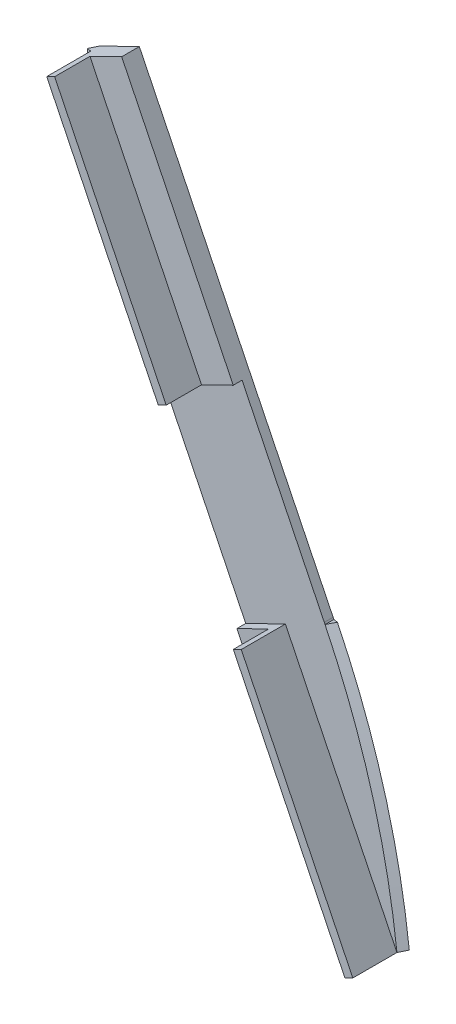
ISO-10303-21;
HEADER;
FILE_DESCRIPTION(('STEP AP214'),'2;1');
FILE_NAME('part.step','',(''),(''),'','','');
FILE_SCHEMA(('AUTOMOTIVE_DESIGN { 1 0 10303 214 1 1 1 1 }'));
ENDSEC;
DATA;
#1=APPLICATION_CONTEXT('core data for automotive mechanical design processes');
#2=APPLICATION_PROTOCOL_DEFINITION('international standard','automotive_design',2000,#1);
#3=PRODUCT_CONTEXT('',#1,'mechanical');
#4=PRODUCT('Part','Part','',(#3));
#5=PRODUCT_RELATED_PRODUCT_CATEGORY('part','',(#4));
#6=PRODUCT_DEFINITION_FORMATION('','',#4);
#7=PRODUCT_DEFINITION_CONTEXT('part definition',#1,'design');
#8=PRODUCT_DEFINITION('design','',#6,#7);
#9=PRODUCT_DEFINITION_SHAPE('','',#8);
#10=(LENGTH_UNIT() NAMED_UNIT(*) SI_UNIT(.MILLI.,.METRE.));
#11=(NAMED_UNIT(*) PLANE_ANGLE_UNIT() SI_UNIT($,.RADIAN.));
#12=(NAMED_UNIT(*) SI_UNIT($,.STERADIAN.) SOLID_ANGLE_UNIT());
#13=UNCERTAINTY_MEASURE_WITH_UNIT(LENGTH_MEASURE(1.E-05),#10,'distance_accuracy_value','');
#14=(GEOMETRIC_REPRESENTATION_CONTEXT(3) GLOBAL_UNCERTAINTY_ASSIGNED_CONTEXT((#13)) GLOBAL_UNIT_ASSIGNED_CONTEXT((#10,
#11,#12)) REPRESENTATION_CONTEXT('',''));
#15=CARTESIAN_POINT('',(0.,0.,0.));
#16=DIRECTION('',(0.,0.,1.));
#17=DIRECTION('',(1.,0.,0.));
#18=AXIS2_PLACEMENT_3D('',#15,#16,#17);
#19=CARTESIAN_POINT('',(541.281171858888,168.838199082787,737.));
#20=DIRECTION('',(0.,0.,-1.));
#21=DIRECTION('',(0.438371146789082,-0.898794046299165,0.));
#22=AXIS2_PLACEMENT_3D('',#19,#20,#21);
#23=PLANE('',#22);
#24=DIRECTION('',(0.898794046299165,0.438371146789082,0.));
#25=VECTOR('',#24,1.);
#26=CARTESIAN_POINT('',(99.8110952294884,-45.1752745496518,737.));
#27=LINE('',#26,#25);
#28=CARTESIAN_POINT('',(99.8110952294884,-45.1752745496518,737.));
#29=VERTEX_POINT('',#28);
#30=CARTESIAN_POINT('',(126.774916618463,-32.0241401459793,737.));
#31=VERTEX_POINT('',#30);
#32=EDGE_CURVE('E604',#29,#31,#27,.T.);
#33=ORIENTED_EDGE('',*,*,#32,.F.);
#34=DIRECTION('',(0.438371146789082,-0.898794046299165,0.));
#35=VECTOR('',#34,1.);
#36=CARTESIAN_POINT('',(23.9728868349773,110.316095460104,737.));
#37=LINE('',#36,#35);
#38=CARTESIAN_POINT('',(23.9728868349773,110.316095460104,737.));
#39=VERTEX_POINT('',#38);
#40=EDGE_CURVE('E633',#39,#29,#37,.T.);
#41=ORIENTED_EDGE('',*,*,#40,.F.);
#42=CARTESIAN_POINT('',(23.9728868349773,110.316095460104,737.));
#43=CARTESIAN_POINT('',(30.5996850451975,51.7382692180576,737.));
#44=CARTESIAN_POINT('',(47.1278272447323,-5.2875613642423,737.));
#45=CARTESIAN_POINT('',(72.8484642933743,-58.325831649288,737.));
#46=B_SPLINE_CURVE_WITH_KNOTS('',3,(#42,#43,#44,#45),.UNSPECIFIED.,.F.,.F.,(4,4),(0.,1.),.UNSPECIFIED.);
#47=CARTESIAN_POINT('',(72.8484642933743,-58.325831649288,737.));
#48=VERTEX_POINT('',#47);
#49=EDGE_CURVE('E522',#39,#48,#46,.T.);
#50=ORIENTED_EDGE('',*,*,#49,.T.);
#51=CARTESIAN_POINT('',(541.281171858888,168.838199082787,737.));
#52=DIRECTION('',(0.,0.,-1.));
#53=DIRECTION('',(-0.898794046299165,-0.438371146789081,0.));
#54=AXIS2_PLACEMENT_3D('',#51,#52,#53);
#55=CIRCLE('',#54,520.608008358308);
#56=CARTESIAN_POINT('',(73.3617934907751,-59.3813305688237,737.));
#57=VERTEX_POINT('',#56);
#58=EDGE_CURVE('E698',#57,#48,#55,.T.);
#59=ORIENTED_EDGE('',*,*,#58,.F.);
#60=DIRECTION('',(-0.438371146789082,0.898794046299165,0.));
#61=VECTOR('',#60,1.);
#62=CARTESIAN_POINT('',(101.056549710641,-116.163995638017,737.));
#63=LINE('',#62,#61);
#64=CARTESIAN_POINT('',(129.265825580769,-174.00158232271,737.));
#65=VERTEX_POINT('',#64);
#66=EDGE_CURVE('E338',#65,#57,#63,.T.);
#67=ORIENTED_EDGE('',*,*,#66,.F.);
#68=DIRECTION('',(-0.898794046299165,-0.438371146789082,0.));
#69=VECTOR('',#68,1.);
#70=CARTESIAN_POINT('',(156.229646969744,-160.850447919037,737.));
#71=LINE('',#70,#69);
#72=CARTESIAN_POINT('',(156.229646969744,-160.850447919037,737.));
#73=VERTEX_POINT('',#72);
#74=EDGE_CURVE('E655',#73,#65,#71,.T.);
#75=ORIENTED_EDGE('',*,*,#74,.F.);
#76=DIRECTION('',(-0.438371146789082,0.898794046299165,0.));
#77=VECTOR('',#76,1.);
#78=CARTESIAN_POINT('',(232.067855364255,-316.341817928793,737.));
#79=LINE('',#78,#77);
#80=CARTESIAN_POINT('',(232.067855364255,-316.341817928793,737.));
#81=VERTEX_POINT('',#80);
#82=EDGE_CURVE('E378',#81,#73,#79,.T.);
#83=ORIENTED_EDGE('',*,*,#82,.F.);
#84=CARTESIAN_POINT('',(232.067855364255,-316.341817928793,737.));
#85=CARTESIAN_POINT('',(225.441057154035,-257.763991686746,737.));
#86=CARTESIAN_POINT('',(208.9129149545,-200.738161104447,737.));
#87=CARTESIAN_POINT('',(183.192277905858,-147.699890819401,737.));
#88=B_SPLINE_CURVE_WITH_KNOTS('',3,(#84,#85,#86,#87),.UNSPECIFIED.,.F.,.F.,(4,4),(0.,1.),.UNSPECIFIED.);
#89=CARTESIAN_POINT('',(183.192277905858,-147.699890819401,737.));
#90=VERTEX_POINT('',#89);
#91=EDGE_CURVE('E274',#81,#90,#88,.T.);
#92=ORIENTED_EDGE('',*,*,#91,.T.);
#93=CARTESIAN_POINT('',(-285.240429659655,-374.863921551476,737.));
#94=DIRECTION('',(0.,0.,-1.));
#95=DIRECTION('',(0.438371146789082,-0.898794046299165,0.));
#96=AXIS2_PLACEMENT_3D('',#93,#94,#95);
#97=CIRCLE('',#96,520.608008358308);
#98=CARTESIAN_POINT('',(182.678948708457,-146.644391899865,737.));
#99=VERTEX_POINT('',#98);
#100=EDGE_CURVE('E330',#99,#90,#97,.T.);
#101=ORIENTED_EDGE('',*,*,#100,.F.);
#102=DIRECTION('',(0.438371146789082,-0.898794046299165,0.));
#103=VECTOR('',#102,1.);
#104=CARTESIAN_POINT('',(154.984192488591,-89.861726830672,737.));
#105=LINE('',#104,#103);
#106=EDGE_CURVE('E339',#31,#99,#105,.T.);
#107=ORIENTED_EDGE('',*,*,#106,.F.);
#108=EDGE_LOOP('',(#33,#41,#50,#59,#67,#75,#83,#92,#101,#107));
#109=FACE_BOUND('',#108,.T.);
#110=ADVANCED_FACE('F134',(#109),#23,.F.);
#111=CARTESIAN_POINT('',(541.281171858888,168.838199082787,737.));
#112=DIRECTION('',(0.,0.,-1.));
#113=DIRECTION('',(0.438371146789082,-0.898794046299165,0.));
#114=AXIS2_PLACEMENT_3D('',#111,#112,#113);
#115=CYLINDRICAL_SURFACE('',#114,520.608008358308);
#116=DIRECTION('',(0.,0.,1.));
#117=VECTOR('',#116,1.);
#118=CARTESIAN_POINT('',(72.8472738405134,-58.3264089533242,731.));
#119=LINE('',#118,#117);
#120=CARTESIAN_POINT('',(72.848461990243,-58.3258294568053,731.));
#121=VERTEX_POINT('',#120);
#122=EDGE_CURVE('E521',#121,#48,#119,.T.);
#123=ORIENTED_EDGE('',*,*,#122,.F.);
#124=CARTESIAN_POINT('',(541.281171858888,168.838199082787,731.));
#125=DIRECTION('',(0.,0.,-1.));
#126=DIRECTION('',(0.438371146789082,-0.898794046299165,0.));
#127=AXIS2_PLACEMENT_3D('',#124,#125,#126);
#128=CIRCLE('',#127,520.608008358308);
#129=CARTESIAN_POINT('',(73.3617934907752,-59.3813305688239,731.));
#130=VERTEX_POINT('',#129);
#131=EDGE_CURVE('E789',#130,#121,#128,.T.);
#132=ORIENTED_EDGE('',*,*,#131,.F.);
#133=DIRECTION('',(0.,0.,1.));
#134=VECTOR('',#133,1.);
#135=CARTESIAN_POINT('',(73.3617934907753,-59.3813305688241,731.));
#136=LINE('',#135,#134);
#137=EDGE_CURVE('E147',#130,#57,#136,.T.);
#138=ORIENTED_EDGE('',*,*,#137,.T.);
#139=ORIENTED_EDGE('',*,*,#58,.T.);
#140=EDGE_LOOP('',(#123,#132,#138,#139));
#141=FACE_BOUND('',#140,.T.);
#142=ADVANCED_FACE('F321',(#141),#115,.T.);
#143=CARTESIAN_POINT('',(205.10403397528,-329.492952332465,737.));
#144=DIRECTION('',(0.438371146789082,-0.898794046299165,0.));
#145=DIRECTION('',(0.,0.,1.));
#146=AXIS2_PLACEMENT_3D('',#143,#144,#145);
#147=PLANE('',#146);
#148=DIRECTION('',(-0.898794046299165,-0.438371146789082,0.));
#149=VECTOR('',#148,1.);
#150=CARTESIAN_POINT('',(205.10403397528,-329.492952332465,731.));
#151=LINE('',#150,#149);
#152=CARTESIAN_POINT('',(232.067855364255,-316.341817928793,731.));
#153=VERTEX_POINT('',#152);
#154=CARTESIAN_POINT('',(205.10403397528,-329.492952332465,731.));
#155=VERTEX_POINT('',#154);
#156=EDGE_CURVE('E301',#153,#155,#151,.T.);
#157=ORIENTED_EDGE('',*,*,#156,.F.);
#158=DIRECTION('',(0.803905834118811,0.39209107343797,0.447213595499958));
#159=VECTOR('',#158,1.);
#160=CARTESIAN_POINT('',(232.067855364255,-316.341817928793,731.));
#161=LINE('',#160,#159);
#162=CARTESIAN_POINT('',(237.46061964205,-313.711591048058,734.));
#163=VERTEX_POINT('',#162);
#164=EDGE_CURVE('E281',#153,#163,#161,.T.);
#165=ORIENTED_EDGE('',*,*,#164,.T.);
#166=DIRECTION('',(-0.803905834118811,-0.39209107343797,0.447213595499958));
#167=VECTOR('',#166,1.);
#168=CARTESIAN_POINT('',(232.067855364255,-316.341817928793,737.));
#169=LINE('',#168,#167);
#170=EDGE_CURVE('E267',#163,#81,#169,.T.);
#171=ORIENTED_EDGE('',*,*,#170,.T.);
#172=DIRECTION('',(0.,0.,-1.));
#173=VECTOR('',#172,1.);
#174=CARTESIAN_POINT('',(232.067855364255,-316.341817928793,767.));
#175=LINE('',#174,#173);
#176=CARTESIAN_POINT('',(232.067855364255,-316.341817928793,767.));
#177=VERTEX_POINT('',#176);
#178=EDGE_CURVE('E678',#177,#81,#175,.T.);
#179=ORIENTED_EDGE('',*,*,#178,.F.);
#180=DIRECTION('',(0.898794046299165,0.438371146789082,0.));
#181=VECTOR('',#180,1.);
#182=CARTESIAN_POINT('',(229.371473225358,-317.65693136916,767.));
#183=LINE('',#182,#181);
#184=CARTESIAN_POINT('',(226.67509108646,-318.972044809527,767.));
#185=VERTEX_POINT('',#184);
#186=EDGE_CURVE('E668',#185,#177,#183,.T.);
#187=ORIENTED_EDGE('',*,*,#186,.F.);
#188=DIRECTION('',(0.,0.,1.));
#189=VECTOR('',#188,1.);
#190=CARTESIAN_POINT('',(226.67509108646,-318.972044809527,767.));
#191=LINE('',#190,#189);
#192=CARTESIAN_POINT('',(226.67509108646,-318.972044809527,743.));
#193=VERTEX_POINT('',#192);
#194=EDGE_CURVE('E637',#193,#185,#191,.T.);
#195=ORIENTED_EDGE('',*,*,#194,.F.);
#196=DIRECTION('',(0.898794046299165,0.438371146789082,0.));
#197=VECTOR('',#196,1.);
#198=CARTESIAN_POINT('',(229.371473225358,-317.65693136916,743.));
#199=LINE('',#198,#197);
#200=CARTESIAN_POINT('',(205.10403397528,-329.492952332465,743.));
#201=VERTEX_POINT('',#200);
#202=EDGE_CURVE('E652',#201,#193,#199,.T.);
#203=ORIENTED_EDGE('',*,*,#202,.F.);
#204=DIRECTION('',(0.,0.,-1.));
#205=VECTOR('',#204,1.);
#206=CARTESIAN_POINT('',(205.10403397528,-329.492952332465,737.));
#207=LINE('',#206,#205);
#208=EDGE_CURVE('E679',#201,#155,#207,.T.);
#209=ORIENTED_EDGE('',*,*,#208,.T.);
#210=EDGE_LOOP('',(#157,#165,#171,#179,#187,#195,#203,#209));
#211=FACE_BOUND('',#210,.T.);
#212=ADVANCED_FACE('F298',(#211),#147,.T.);
#213=CARTESIAN_POINT('',(-285.240429659655,-374.863921551476,737.));
#214=DIRECTION('',(0.,0.,-1.));
#215=DIRECTION('',(0.438371146789082,-0.898794046299165,0.));
#216=AXIS2_PLACEMENT_3D('',#213,#214,#215);
#217=CYLINDRICAL_SURFACE('',#216,520.608008358308);
#218=DIRECTION('',(0.,0.,1.));
#219=VECTOR('',#218,1.);
#220=CARTESIAN_POINT('',(183.193468358719,-147.699313515365,731.));
#221=LINE('',#220,#219);
#222=CARTESIAN_POINT('',(183.192280207285,-147.69989301272,731.));
#223=VERTEX_POINT('',#222);
#224=EDGE_CURVE('E155',#223,#90,#221,.T.);
#225=ORIENTED_EDGE('',*,*,#224,.F.);
#226=CARTESIAN_POINT('',(182.678948708457,-146.644391899865,731.));
#227=CARTESIAN_POINT('',(192.416469439502,-166.609268062184,731.));
#228=CARTESIAN_POINT('',(200.418215911782,-187.331582077665,731.));
#229=CARTESIAN_POINT('',(208.41963839983,-208.053057063442,731.));
#230=CARTESIAN_POINT('',(214.62724410855,-229.381939545572,731.));
#231=CARTESIAN_POINT('',(220.834514496107,-250.709669888533,731.));
#232=CARTESIAN_POINT('',(225.202748273277,-272.489801440326,731.));
#233=CARTESIAN_POINT('',(229.570805186664,-294.269051144521,731.));
#234=CARTESIAN_POINT('',(232.067855364255,-316.341817928793,731.));
#235=B_SPLINE_CURVE_WITH_KNOTS('',2,(#226,#227,#228,#229,#230,#231,#232,#233,#234),
.UNSPECIFIED.,.F.,.F.,(3,2,2,2,3),(0.,0.25,0.5,0.75,1.),.UNSPECIFIED.);
#236=CARTESIAN_POINT('',(182.678948708457,-146.644391899865,731.));
#237=VERTEX_POINT('',#236);
#238=EDGE_CURVE('E760',#237,#223,#235,.T.);
#239=ORIENTED_EDGE('',*,*,#238,.F.);
#240=DIRECTION('',(0.,0.,-1.));
#241=VECTOR('',#240,1.);
#242=CARTESIAN_POINT('',(182.678948708457,-146.644391899865,737.));
#243=LINE('',#242,#241);
#244=EDGE_CURVE('E683',#99,#237,#243,.T.);
#245=ORIENTED_EDGE('',*,*,#244,.F.);
#246=ORIENTED_EDGE('',*,*,#100,.T.);
#247=EDGE_LOOP('',(#225,#239,#245,#246));
#248=FACE_BOUND('',#247,.T.);
#249=ADVANCED_FACE('F320',(#248),#217,.T.);
#250=CARTESIAN_POINT('',(261.354858682711,-307.953912359823,731.));
#251=DIRECTION('',(0.,0.,1.));
#252=DIRECTION('',(-0.438371146789082,0.898794046299165,0.));
#253=AXIS2_PLACEMENT_3D('',#250,#251,#252);
#254=PLANE('',#253);
#255=DIRECTION('',(-0.438371146789082,0.898794046299165,0.));
#256=VECTOR('',#255,1.);
#257=CARTESIAN_POINT('',(183.508910435906,-148.346065618017,731.));
#258=LINE('',#257,#256);
#259=CARTESIAN_POINT('',(50.9367082239522,123.467229863776,731.));
#260=VERTEX_POINT('',#259);
#261=EDGE_CURVE('E682',#237,#260,#258,.T.);
#262=ORIENTED_EDGE('',*,*,#261,.F.);
#263=ORIENTED_EDGE('',*,*,#238,.T.);
#264=CARTESIAN_POINT('',(232.067855364255,-316.341817928793,731.));
#265=CARTESIAN_POINT('',(225.441057154035,-257.763991686746,731.));
#266=CARTESIAN_POINT('',(208.9129149545,-200.738161104447,731.));
#267=CARTESIAN_POINT('',(183.192277905858,-147.699890819401,731.));
#268=B_SPLINE_CURVE_WITH_KNOTS('',3,(#264,#265,#266,#267),.UNSPECIFIED.,.F.,.F.,(4,4),(0.,1.),.UNSPECIFIED.);
#269=EDGE_CURVE('E294',#153,#223,#268,.T.);
#270=ORIENTED_EDGE('',*,*,#269,.F.);
#271=ORIENTED_EDGE('',*,*,#156,.T.);
#272=DIRECTION('',(0.438371146789082,-0.898794046299165,0.));
#273=VECTOR('',#272,1.);
#274=CARTESIAN_POINT('',(73.3617934907751,-59.3813305688237,731.));
#275=LINE('',#274,#273);
#276=EDGE_CURVE('E13',#130,#155,#275,.T.);
#277=ORIENTED_EDGE('',*,*,#276,.F.);
#278=ORIENTED_EDGE('',*,*,#131,.T.);
#279=CARTESIAN_POINT('',(23.9728868349773,110.316095460104,731.));
#280=CARTESIAN_POINT('',(30.5996850451975,51.7382692180576,731.));
#281=CARTESIAN_POINT('',(47.1278272447323,-5.2875613642423,731.));
#282=CARTESIAN_POINT('',(72.8484642933743,-58.325831649288,731.));
#283=B_SPLINE_CURVE_WITH_KNOTS('',3,(#279,#280,#281,#282),.UNSPECIFIED.,.F.,.F.,(4,4),(0.,1.),.UNSPECIFIED.);
#284=CARTESIAN_POINT('',(23.9728868349773,110.316095460104,731.));
#285=VERTEX_POINT('',#284);
#286=EDGE_CURVE('E523',#285,#121,#283,.T.);
#287=ORIENTED_EDGE('',*,*,#286,.F.);
#288=DIRECTION('',(-0.898794046299165,-0.438371146789082,0.));
#289=VECTOR('',#288,1.);
#290=CARTESIAN_POINT('',(50.9367082239522,123.467229863776,731.));
#291=LINE('',#290,#289);
#292=EDGE_CURVE('E687',#260,#285,#291,.T.);
#293=ORIENTED_EDGE('',*,*,#292,.F.);
#294=EDGE_LOOP('',(#262,#263,#270,#271,#277,#278,#287,#293));
#295=FACE_BOUND('',#294,.T.);
#296=ADVANCED_FACE('F765',(#295),#254,.F.);
#297=CARTESIAN_POINT('',(73.3617934907753,-59.3813305688241,731.));
#298=DIRECTION('',(-0.898794046299165,-0.438371146789082,0.));
#299=DIRECTION('',(0.438371146789082,-0.898794046299165,0.));
#300=AXIS2_PLACEMENT_3D('',#297,#298,#299);
#301=PLANE('',#300);
#302=ORIENTED_EDGE('',*,*,#276,.T.);
#303=ORIENTED_EDGE('',*,*,#208,.F.);
#304=DIRECTION('',(0.438371146789082,-0.898794046299165,0.));
#305=VECTOR('',#304,1.);
#306=CARTESIAN_POINT('',(205.10403397528,-329.492952332465,743.));
#307=LINE('',#306,#305);
#308=CARTESIAN_POINT('',(129.265825580769,-174.00158232271,743.));
#309=VERTEX_POINT('',#308);
#310=EDGE_CURVE('E648',#309,#201,#307,.T.);
#311=ORIENTED_EDGE('',*,*,#310,.F.);
#312=DIRECTION('',(0.,0.,1.));
#313=VECTOR('',#312,1.);
#314=CARTESIAN_POINT('',(129.265825580769,-174.00158232271,737.));
#315=LINE('',#314,#313);
#316=EDGE_CURVE('E664',#65,#309,#315,.T.);
#317=ORIENTED_EDGE('',*,*,#316,.F.);
#318=ORIENTED_EDGE('',*,*,#66,.T.);
#319=ORIENTED_EDGE('',*,*,#137,.F.);
#320=EDGE_LOOP('',(#302,#303,#311,#317,#318,#319));
#321=FACE_BOUND('',#320,.T.);
#322=ADVANCED_FACE('F497',(#321),#301,.T.);
#323=CARTESIAN_POINT('',(50.9367082239522,123.467229863776,731.));
#324=DIRECTION('',(-0.438371146789082,0.898794046299165,0.));
#325=DIRECTION('',(-0.898794046299165,-0.438371146789082,0.));
#326=AXIS2_PLACEMENT_3D('',#323,#324,#325);
#327=PLANE('',#326);
#328=ORIENTED_EDGE('',*,*,#292,.T.);
#329=DIRECTION('',(-0.803905834118811,-0.39209107343797,0.447213595499958));
#330=VECTOR('',#329,1.);
#331=CARTESIAN_POINT('',(23.9728868349773,110.316095460104,731.));
#332=LINE('',#331,#330);
#333=CARTESIAN_POINT('',(18.5801225571823,107.685868579369,734.));
#334=VERTEX_POINT('',#333);
#335=EDGE_CURVE('E748',#285,#334,#332,.T.);
#336=ORIENTED_EDGE('',*,*,#335,.T.);
#337=DIRECTION('',(0.803905834118811,0.39209107343797,0.447213595499958));
#338=VECTOR('',#337,1.);
#339=CARTESIAN_POINT('',(23.9728868349773,110.316095460104,737.));
#340=LINE('',#339,#338);
#341=EDGE_CURVE('E363',#334,#39,#340,.T.);
#342=ORIENTED_EDGE('',*,*,#341,.T.);
#343=DIRECTION('',(0.,0.,-1.));
#344=VECTOR('',#343,1.);
#345=CARTESIAN_POINT('',(23.9728868349773,110.316095460104,767.));
#346=LINE('',#345,#344);
#347=CARTESIAN_POINT('',(23.9728868349773,110.316095460104,767.));
#348=VERTEX_POINT('',#347);
#349=EDGE_CURVE('E609',#348,#39,#346,.T.);
#350=ORIENTED_EDGE('',*,*,#349,.F.);
#351=DIRECTION('',(-0.898794046299165,-0.438371146789082,0.));
#352=VECTOR('',#351,1.);
#353=CARTESIAN_POINT('',(26.6692689738748,111.631208900471,767.));
#354=LINE('',#353,#352);
#355=CARTESIAN_POINT('',(29.3656511127723,112.946322340838,767.));
#356=VERTEX_POINT('',#355);
#357=EDGE_CURVE('E610',#356,#348,#354,.T.);
#358=ORIENTED_EDGE('',*,*,#357,.F.);
#359=DIRECTION('',(0.,0.,1.));
#360=VECTOR('',#359,1.);
#361=CARTESIAN_POINT('',(29.3656511127723,112.946322340838,767.));
#362=LINE('',#361,#360);
#363=CARTESIAN_POINT('',(29.3656511127723,112.946322340838,743.));
#364=VERTEX_POINT('',#363);
#365=EDGE_CURVE('E586',#364,#356,#362,.T.);
#366=ORIENTED_EDGE('',*,*,#365,.F.);
#367=DIRECTION('',(-0.898794046299165,-0.438371146789082,0.));
#368=VECTOR('',#367,1.);
#369=CARTESIAN_POINT('',(26.6692689738748,111.631208900471,743.));
#370=LINE('',#369,#368);
#371=CARTESIAN_POINT('',(50.9367082239522,123.467229863776,743.));
#372=VERTEX_POINT('',#371);
#373=EDGE_CURVE('E601',#372,#364,#370,.T.);
#374=ORIENTED_EDGE('',*,*,#373,.F.);
#375=DIRECTION('',(0.,0.,1.));
#376=VECTOR('',#375,1.);
#377=CARTESIAN_POINT('',(50.9367082239522,123.467229863776,731.));
#378=LINE('',#377,#376);
#379=EDGE_CURVE('E684',#260,#372,#378,.T.);
#380=ORIENTED_EDGE('',*,*,#379,.F.);
#381=EDGE_LOOP('',(#328,#336,#342,#350,#358,#366,#374,#380));
#382=FACE_BOUND('',#381,.T.);
#383=ADVANCED_FACE('F136',(#382),#327,.T.);
#384=CARTESIAN_POINT('',(183.508910435906,-148.346065618017,731.));
#385=DIRECTION('',(0.898794046299165,0.438371146789082,0.));
#386=DIRECTION('',(-0.438371146789082,0.898794046299165,0.));
#387=AXIS2_PLACEMENT_3D('',#384,#385,#386);
#388=PLANE('',#387);
#389=ORIENTED_EDGE('',*,*,#379,.T.);
#390=DIRECTION('',(-0.438371146789082,0.898794046299165,0.));
#391=VECTOR('',#390,1.);
#392=CARTESIAN_POINT('',(50.9367082239522,123.467229863776,743.));
#393=LINE('',#392,#391);
#394=CARTESIAN_POINT('',(126.774916618463,-32.0241401459793,743.));
#395=VERTEX_POINT('',#394);
#396=EDGE_CURVE('E597',#395,#372,#393,.T.);
#397=ORIENTED_EDGE('',*,*,#396,.F.);
#398=DIRECTION('',(0.,0.,1.));
#399=VECTOR('',#398,1.);
#400=CARTESIAN_POINT('',(126.774916618463,-32.0241401459793,737.));
#401=LINE('',#400,#399);
#402=EDGE_CURVE('E611',#31,#395,#401,.T.);
#403=ORIENTED_EDGE('',*,*,#402,.F.);
#404=ORIENTED_EDGE('',*,*,#106,.T.);
#405=ORIENTED_EDGE('',*,*,#244,.T.);
#406=ORIENTED_EDGE('',*,*,#261,.T.);
#407=EDGE_LOOP('',(#389,#397,#403,#404,#405,#406));
#408=FACE_BOUND('',#407,.T.);
#409=ADVANCED_FACE('F773',(#408),#388,.T.);
#410=CARTESIAN_POINT('',(232.067855364255,-316.341817928793,767.));
#411=DIRECTION('',(0.898794046299165,0.438371146789082,0.));
#412=DIRECTION('',(0.,0.,-1.));
#413=AXIS2_PLACEMENT_3D('',#410,#411,#412);
#414=PLANE('',#413);
#415=ORIENTED_EDGE('',*,*,#82,.T.);
#416=DIRECTION('',(0.,0.,-1.));
#417=VECTOR('',#416,1.);
#418=CARTESIAN_POINT('',(156.229646969744,-160.850447919037,767.));
#419=LINE('',#418,#417);
#420=CARTESIAN_POINT('',(156.229646969744,-160.850447919037,767.));
#421=VERTEX_POINT('',#420);
#422=EDGE_CURVE('E656',#421,#73,#419,.T.);
#423=ORIENTED_EDGE('',*,*,#422,.F.);
#424=DIRECTION('',(-0.438371146789082,0.898794046299165,0.));
#425=VECTOR('',#424,1.);
#426=CARTESIAN_POINT('',(232.067855364255,-316.341817928793,767.));
#427=LINE('',#426,#425);
#428=EDGE_CURVE('E671',#177,#421,#427,.T.);
#429=ORIENTED_EDGE('',*,*,#428,.F.);
#430=ORIENTED_EDGE('',*,*,#178,.T.);
#431=EDGE_LOOP('',(#415,#423,#429,#430));
#432=FACE_BOUND('',#431,.T.);
#433=ADVANCED_FACE('F928',(#432),#414,.T.);
#434=CARTESIAN_POINT('',(229.371473225358,-317.65693136916,767.));
#435=DIRECTION('',(0.,0.,1.));
#436=DIRECTION('',(0.898794046299165,0.438371146789082,0.));
#437=AXIS2_PLACEMENT_3D('',#434,#435,#436);
#438=PLANE('',#437);
#439=ORIENTED_EDGE('',*,*,#428,.T.);
#440=DIRECTION('',(0.898794046299165,0.438371146789082,0.));
#441=VECTOR('',#440,1.);
#442=CARTESIAN_POINT('',(153.533264830847,-162.165561359404,767.));
#443=LINE('',#442,#441);
#444=CARTESIAN_POINT('',(150.836882691949,-163.480674799772,767.));
#445=VERTEX_POINT('',#444);
#446=EDGE_CURVE('E660',#445,#421,#443,.T.);
#447=ORIENTED_EDGE('',*,*,#446,.F.);
#448=DIRECTION('',(-0.438371146789082,0.898794046299165,0.));
#449=VECTOR('',#448,1.);
#450=CARTESIAN_POINT('',(150.836882691949,-163.480674799772,767.));
#451=LINE('',#450,#449);
#452=EDGE_CURVE('E641',#185,#445,#451,.T.);
#453=ORIENTED_EDGE('',*,*,#452,.F.);
#454=ORIENTED_EDGE('',*,*,#186,.T.);
#455=EDGE_LOOP('',(#439,#447,#453,#454));
#456=FACE_BOUND('',#455,.T.);
#457=ADVANCED_FACE('F933',(#456),#438,.T.);
#458=CARTESIAN_POINT('',(156.229646969744,-160.850447919037,737.));
#459=DIRECTION('',(-0.438371146789082,0.898794046299165,0.));
#460=DIRECTION('',(-0.898794046299165,-0.438371146789082,0.));
#461=AXIS2_PLACEMENT_3D('',#458,#459,#460);
#462=PLANE('',#461);
#463=DIRECTION('',(0.,0.,-1.));
#464=VECTOR('',#463,1.);
#465=CARTESIAN_POINT('',(150.836882691949,-163.480674799772,767.));
#466=LINE('',#465,#464);
#467=CARTESIAN_POINT('',(150.836882691949,-163.480674799772,743.));
#468=VERTEX_POINT('',#467);
#469=EDGE_CURVE('E628',#445,#468,#466,.T.);
#470=ORIENTED_EDGE('',*,*,#469,.F.);
#471=ORIENTED_EDGE('',*,*,#446,.T.);
#472=ORIENTED_EDGE('',*,*,#422,.T.);
#473=ORIENTED_EDGE('',*,*,#74,.T.);
#474=ORIENTED_EDGE('',*,*,#316,.T.);
#475=DIRECTION('',(-0.898794046299165,-0.438371146789082,0.));
#476=VECTOR('',#475,1.);
#477=CARTESIAN_POINT('',(153.533264830847,-162.165561359404,743.));
#478=LINE('',#477,#476);
#479=EDGE_CURVE('E645',#468,#309,#478,.T.);
#480=ORIENTED_EDGE('',*,*,#479,.F.);
#481=EDGE_LOOP('',(#470,#471,#472,#473,#474,#480));
#482=FACE_BOUND('',#481,.T.);
#483=ADVANCED_FACE('F939',(#482),#462,.T.);
#484=CARTESIAN_POINT('',(232.067855364255,-316.341817928793,743.));
#485=DIRECTION('',(0.,0.,1.));
#486=DIRECTION('',(-0.438371146789082,0.898794046299165,0.));
#487=AXIS2_PLACEMENT_3D('',#484,#485,#486);
#488=PLANE('',#487);
#489=DIRECTION('',(0.438371146789082,-0.898794046299165,0.));
#490=VECTOR('',#489,1.);
#491=CARTESIAN_POINT('',(150.836882691949,-163.480674799772,743.));
#492=LINE('',#491,#490);
#493=EDGE_CURVE('E632',#468,#193,#492,.T.);
#494=ORIENTED_EDGE('',*,*,#493,.F.);
#495=ORIENTED_EDGE('',*,*,#479,.T.);
#496=ORIENTED_EDGE('',*,*,#310,.T.);
#497=ORIENTED_EDGE('',*,*,#202,.T.);
#498=EDGE_LOOP('',(#494,#495,#496,#497));
#499=FACE_BOUND('',#498,.T.);
#500=ADVANCED_FACE('F946',(#499),#488,.T.);
#501=CARTESIAN_POINT('',(226.67509108646,-318.972044809527,737.));
#502=DIRECTION('',(-0.898794046299165,-0.438371146789082,0.));
#503=DIRECTION('',(0.438371146789082,-0.898794046299165,0.));
#504=AXIS2_PLACEMENT_3D('',#501,#502,#503);
#505=PLANE('',#504);
#506=ORIENTED_EDGE('',*,*,#469,.T.);
#507=ORIENTED_EDGE('',*,*,#493,.T.);
#508=ORIENTED_EDGE('',*,*,#194,.T.);
#509=ORIENTED_EDGE('',*,*,#452,.T.);
#510=EDGE_LOOP('',(#506,#507,#508,#509));
#511=FACE_BOUND('',#510,.T.);
#512=ADVANCED_FACE('F952',(#511),#505,.T.);
#513=CARTESIAN_POINT('',(23.9728868349773,110.316095460104,767.));
#514=DIRECTION('',(-0.898794046299165,-0.438371146789082,0.));
#515=DIRECTION('',(0.,0.,-1.));
#516=AXIS2_PLACEMENT_3D('',#513,#514,#515);
#517=PLANE('',#516);
#518=ORIENTED_EDGE('',*,*,#40,.T.);
#519=DIRECTION('',(0.,0.,-1.));
#520=VECTOR('',#519,1.);
#521=CARTESIAN_POINT('',(99.8110952294884,-45.1752745496518,767.));
#522=LINE('',#521,#520);
#523=CARTESIAN_POINT('',(99.8110952294884,-45.1752745496518,767.));
#524=VERTEX_POINT('',#523);
#525=EDGE_CURVE('E616',#524,#29,#522,.T.);
#526=ORIENTED_EDGE('',*,*,#525,.F.);
#527=DIRECTION('',(0.438371146789082,-0.898794046299165,0.));
#528=VECTOR('',#527,1.);
#529=CARTESIAN_POINT('',(23.9728868349773,110.316095460104,767.));
#530=LINE('',#529,#528);
#531=EDGE_CURVE('E605',#348,#524,#530,.T.);
#532=ORIENTED_EDGE('',*,*,#531,.F.);
#533=ORIENTED_EDGE('',*,*,#349,.T.);
#534=EDGE_LOOP('',(#518,#526,#532,#533));
#535=FACE_BOUND('',#534,.T.);
#536=ADVANCED_FACE('F893',(#535),#517,.T.);
#537=CARTESIAN_POINT('',(26.6692689738748,111.631208900471,767.));
#538=DIRECTION('',(0.,0.,1.));
#539=DIRECTION('',(-0.898794046299165,-0.438371146789082,0.));
#540=AXIS2_PLACEMENT_3D('',#537,#538,#539);
#541=PLANE('',#540);
#542=ORIENTED_EDGE('',*,*,#531,.T.);
#543=DIRECTION('',(-0.898794046299165,-0.438371146789082,0.));
#544=VECTOR('',#543,1.);
#545=CARTESIAN_POINT('',(102.507477368386,-43.8601611092845,767.));
#546=LINE('',#545,#544);
#547=CARTESIAN_POINT('',(105.203859507283,-42.5450476689173,767.));
#548=VERTEX_POINT('',#547);
#549=EDGE_CURVE('E615',#548,#524,#546,.T.);
#550=ORIENTED_EDGE('',*,*,#549,.F.);
#551=DIRECTION('',(0.438371146789082,-0.898794046299165,0.));
#552=VECTOR('',#551,1.);
#553=CARTESIAN_POINT('',(105.203859507283,-42.5450476689173,767.));
#554=LINE('',#553,#552);
#555=EDGE_CURVE('E590',#356,#548,#554,.T.);
#556=ORIENTED_EDGE('',*,*,#555,.F.);
#557=ORIENTED_EDGE('',*,*,#357,.T.);
#558=EDGE_LOOP('',(#542,#550,#556,#557));
#559=FACE_BOUND('',#558,.T.);
#560=ADVANCED_FACE('F895',(#559),#541,.T.);
#561=CARTESIAN_POINT('',(99.8110952294884,-45.1752745496518,737.));
#562=DIRECTION('',(0.438371146789082,-0.898794046299165,0.));
#563=DIRECTION('',(0.898794046299165,0.438371146789082,0.));
#564=AXIS2_PLACEMENT_3D('',#561,#562,#563);
#565=PLANE('',#564);
#566=DIRECTION('',(0.,0.,-1.));
#567=VECTOR('',#566,1.);
#568=CARTESIAN_POINT('',(105.203859507283,-42.5450476689173,767.));
#569=LINE('',#568,#567);
#570=CARTESIAN_POINT('',(105.203859507283,-42.5450476689173,743.));
#571=VERTEX_POINT('',#570);
#572=EDGE_CURVE('E572',#548,#571,#569,.T.);
#573=ORIENTED_EDGE('',*,*,#572,.F.);
#574=ORIENTED_EDGE('',*,*,#549,.T.);
#575=ORIENTED_EDGE('',*,*,#525,.T.);
#576=ORIENTED_EDGE('',*,*,#32,.T.);
#577=ORIENTED_EDGE('',*,*,#402,.T.);
#578=DIRECTION('',(0.898794046299165,0.438371146789082,0.));
#579=VECTOR('',#578,1.);
#580=CARTESIAN_POINT('',(102.507477368386,-43.8601611092845,743.));
#581=LINE('',#580,#579);
#582=EDGE_CURVE('E594',#571,#395,#581,.T.);
#583=ORIENTED_EDGE('',*,*,#582,.F.);
#584=EDGE_LOOP('',(#573,#574,#575,#576,#577,#583));
#585=FACE_BOUND('',#584,.T.);
#586=ADVANCED_FACE('F899',(#585),#565,.T.);
#587=CARTESIAN_POINT('',(23.9728868349773,110.316095460104,743.));
#588=DIRECTION('',(0.,0.,1.));
#589=DIRECTION('',(0.438371146789082,-0.898794046299165,0.));
#590=AXIS2_PLACEMENT_3D('',#587,#588,#589);
#591=PLANE('',#590);
#592=DIRECTION('',(-0.438371146789082,0.898794046299165,0.));
#593=VECTOR('',#592,1.);
#594=CARTESIAN_POINT('',(105.203859507283,-42.5450476689173,743.));
#595=LINE('',#594,#593);
#596=EDGE_CURVE('E581',#571,#364,#595,.T.);
#597=ORIENTED_EDGE('',*,*,#596,.F.);
#598=ORIENTED_EDGE('',*,*,#582,.T.);
#599=ORIENTED_EDGE('',*,*,#396,.T.);
#600=ORIENTED_EDGE('',*,*,#373,.T.);
#601=EDGE_LOOP('',(#597,#598,#599,#600));
#602=FACE_BOUND('',#601,.T.);
#603=ADVANCED_FACE('F904',(#602),#591,.T.);
#604=CARTESIAN_POINT('',(29.3656511127723,112.946322340838,737.));
#605=DIRECTION('',(0.898794046299165,0.438371146789082,0.));
#606=DIRECTION('',(-0.438371146789082,0.898794046299165,0.));
#607=AXIS2_PLACEMENT_3D('',#604,#605,#606);
#608=PLANE('',#607);
#609=ORIENTED_EDGE('',*,*,#572,.T.);
#610=ORIENTED_EDGE('',*,*,#596,.T.);
#611=ORIENTED_EDGE('',*,*,#365,.T.);
#612=ORIENTED_EDGE('',*,*,#555,.T.);
#613=EDGE_LOOP('',(#609,#610,#611,#612));
#614=FACE_BOUND('',#613,.T.);
#615=ADVANCED_FACE('F549',(#614),#608,.T.);
#616=CARTESIAN_POINT('',(99.8110952294884,-45.1752745496518,731.));
#617=DIRECTION('',(0.438371146789082,-0.898794046299165,0.));
#618=DIRECTION('',(0.,0.,1.));
#619=AXIS2_PLACEMENT_3D('',#616,#617,#618);
#620=PLANE('',#619);
#621=DIRECTION('',(0.80390583411881,0.39209107343797,-0.447213595499958));
#622=VECTOR('',#621,1.);
#623=CARTESIAN_POINT('',(67.4545095627184,-60.9566358340587,734.));
#624=LINE('',#623,#622);
#625=CARTESIAN_POINT('',(67.4557000155793,-60.9560585300225,734.));
#626=VERTEX_POINT('',#625);
#627=EDGE_CURVE('E511',#626,#121,#624,.T.);
#628=ORIENTED_EDGE('',*,*,#627,.T.);
#629=ORIENTED_EDGE('',*,*,#122,.T.);
#630=DIRECTION('',(-0.80390583411881,-0.39209107343797,-0.447213595499958));
#631=VECTOR('',#630,1.);
#632=CARTESIAN_POINT('',(67.4545095627184,-60.9566358340587,734.));
#633=LINE('',#632,#631);
#634=EDGE_CURVE('E582',#48,#626,#633,.T.);
#635=ORIENTED_EDGE('',*,*,#634,.T.);
#636=EDGE_LOOP('',(#628,#629,#635));
#637=FACE_BOUND('',#636,.T.);
#638=ADVANCED_FACE('F539',(#637),#620,.T.);
#639=CARTESIAN_POINT('',(18.5801225571823,107.685868579369,734.));
#640=CARTESIAN_POINT('',(25.2069207674025,49.1080423373231,734.));
#641=CARTESIAN_POINT('',(41.7350629669374,-7.91778824497674,734.));
#642=CARTESIAN_POINT('',(67.4557000155793,-60.9560585300225,734.));
#643=CARTESIAN_POINT('',(19.0295195803318,107.905054152764,733.75));
#644=CARTESIAN_POINT('',(25.6563177905521,49.3272279107176,733.75));
#645=CARTESIAN_POINT('',(42.1844599900869,-7.69860267158223,733.75));
#646=CARTESIAN_POINT('',(67.9050970387289,-60.736872956628,733.75));
#647=CARTESIAN_POINT('',(19.9283136266311,108.343425299553,733.25));
#648=CARTESIAN_POINT('',(26.5551118368513,49.7655990575066,733.25));
#649=CARTESIAN_POINT('',(43.0832540363862,-7.26023152479316,733.25));
#650=CARTESIAN_POINT('',(68.8038910850281,-60.298501809839,733.25));
#651=CARTESIAN_POINT('',(21.2765046960796,109.000982019737,732.5));
#652=CARTESIAN_POINT('',(27.9033029063,50.4231557776905,732.5));
#653=CARTESIAN_POINT('',(44.4314451058348,-6.60267480460947,732.5));
#654=CARTESIAN_POINT('',(70.1520821544767,-59.6409450896553,732.5));
#655=CARTESIAN_POINT('',(22.6246957655286,109.65853873992,731.75));
#656=CARTESIAN_POINT('',(29.2514939757489,51.0807124978737,731.75));
#657=CARTESIAN_POINT('',(45.7796361752837,-5.94511808442605,731.75));
#658=CARTESIAN_POINT('',(71.5002732239256,-58.9833883694717,731.75));
#659=CARTESIAN_POINT('',(23.5234898118277,110.096909886709,731.25));
#660=CARTESIAN_POINT('',(30.1502880220479,51.5190836446631,731.25));
#661=CARTESIAN_POINT('',(46.6784302215828,-5.50674693763681,731.25));
#662=CARTESIAN_POINT('',(72.3990672702247,-58.5450172226826,731.25));
#663=CARTESIAN_POINT('',(23.9728868349773,110.316095460104,731.));
#664=CARTESIAN_POINT('',(30.5996850451975,51.7382692180576,731.));
#665=CARTESIAN_POINT('',(47.1278272447323,-5.2875613642423,731.));
#666=CARTESIAN_POINT('',(72.8484642933743,-58.325831649288,731.));
#667=B_SPLINE_SURFACE_WITH_KNOTS('',3,3,((#639,#640,#641,#642),(#643,#644,#645,#646),(#647,#648,
#649,#650),(#651,#652,#653,#654),(#655,#656,#657,#658),(#659,#660,#661,#662),(#663,#664,#665,
#666)),.UNSPECIFIED.,.F.,.F.,.F.,(4,1,1,1,4),(4,4),(0.345491502812526,0.431864378515658,
0.518237254218789,0.604610129921921,0.690983005625053),(0.,1.),.UNSPECIFIED.);
#668=CARTESIAN_POINT('',(18.5801225571823,107.685868579369,734.));
#669=CARTESIAN_POINT('',(25.2069207674025,49.1080423373231,734.));
#670=CARTESIAN_POINT('',(41.7350629669374,-7.91778824497674,734.));
#671=CARTESIAN_POINT('',(67.4557000155793,-60.9560585300225,734.));
#672=B_SPLINE_CURVE_WITH_KNOTS('',3,(#668,#669,#670,#671),.UNSPECIFIED.,.F.,.F.,(4,4),(0.,1.),.UNSPECIFIED.);
#673=EDGE_CURVE('E716',#334,#626,#672,.T.);
#674=ORIENTED_EDGE('',*,*,#335,.F.);
#675=ORIENTED_EDGE('',*,*,#286,.T.);
#676=ORIENTED_EDGE('',*,*,#627,.F.);
#677=ORIENTED_EDGE('',*,*,#673,.F.);
#678=EDGE_LOOP('',(#674,#675,#676,#677));
#679=FACE_BOUND('',#678,.T.);
#680=ADVANCED_FACE('F548',(#679),#667,.T.);
#681=CARTESIAN_POINT('',(23.9728868349773,110.316095460104,737.));
#682=CARTESIAN_POINT('',(30.5996850451975,51.7382692180576,737.));
#683=CARTESIAN_POINT('',(47.1278272447323,-5.2875613642423,737.));
#684=CARTESIAN_POINT('',(72.8484642933743,-58.325831649288,737.));
#685=CARTESIAN_POINT('',(23.5234898118277,110.096909886709,736.75));
#686=CARTESIAN_POINT('',(30.1502880220479,51.5190836446631,736.75));
#687=CARTESIAN_POINT('',(46.6784302215828,-5.50674693763681,736.75));
#688=CARTESIAN_POINT('',(72.3990672702247,-58.5450172226826,736.75));
#689=CARTESIAN_POINT('',(22.6246957655286,109.65853873992,736.25));
#690=CARTESIAN_POINT('',(29.2514939757488,51.0807124978738,736.25));
#691=CARTESIAN_POINT('',(45.7796361752836,-5.94511808442594,736.25));
#692=CARTESIAN_POINT('',(71.5002732239255,-58.9833883694716,736.25));
#693=CARTESIAN_POINT('',(21.2765046960796,109.000982019737,735.5));
#694=CARTESIAN_POINT('',(27.9033029063,50.4231557776905,735.5));
#695=CARTESIAN_POINT('',(44.4314451058348,-6.60267480460947,735.5));
#696=CARTESIAN_POINT('',(70.1520821544768,-59.6409450896553,735.5));
#697=CARTESIAN_POINT('',(19.9283136266312,108.343425299553,734.75));
#698=CARTESIAN_POINT('',(26.5551118368514,49.7655990575065,734.75));
#699=CARTESIAN_POINT('',(43.0832540363862,-7.26023152479321,734.75));
#700=CARTESIAN_POINT('',(68.803891085028,-60.2985018098389,734.75));
#701=CARTESIAN_POINT('',(19.0295195803318,107.905054152764,734.25));
#702=CARTESIAN_POINT('',(25.6563177905521,49.3272279107176,734.25));
#703=CARTESIAN_POINT('',(42.1844599900869,-7.69860267158223,734.25));
#704=CARTESIAN_POINT('',(67.9050970387289,-60.736872956628,734.25));
#705=CARTESIAN_POINT('',(18.5801225571823,107.685868579369,734.));
#706=CARTESIAN_POINT('',(25.2069207674025,49.1080423373231,734.));
#707=CARTESIAN_POINT('',(41.7350629669374,-7.91778824497674,734.));
#708=CARTESIAN_POINT('',(67.4557000155793,-60.9560585300225,734.));
#709=B_SPLINE_SURFACE_WITH_KNOTS('',3,3,((#681,#682,#683,#684),(#685,#686,#687,#688),(#689,#690,
#691,#692),(#693,#694,#695,#696),(#697,#698,#699,#700),(#701,#702,#703,#704),(#705,#706,#707,
#708)),.UNSPECIFIED.,.F.,.F.,.F.,(4,1,1,1,4),(4,4),(0.,0.0863728757031316,0.172745751406263,
0.259118627109395,0.345491502812526),(0.,1.),.UNSPECIFIED.);
#710=ORIENTED_EDGE('',*,*,#341,.F.);
#711=ORIENTED_EDGE('',*,*,#673,.T.);
#712=ORIENTED_EDGE('',*,*,#634,.F.);
#713=ORIENTED_EDGE('',*,*,#49,.F.);
#714=EDGE_LOOP('',(#710,#711,#712,#713));
#715=FACE_BOUND('',#714,.T.);
#716=ADVANCED_FACE('F406',(#715),#709,.T.);
#717=CARTESIAN_POINT('',(156.229646969744,-160.850447919037,731.));
#718=DIRECTION('',(-0.438371146789081,0.898794046299165,0.));
#719=DIRECTION('',(0.,0.,-1.));
#720=AXIS2_PLACEMENT_3D('',#717,#718,#719);
#721=PLANE('',#720);
#722=DIRECTION('',(-0.803905834118811,-0.39209107343797,-0.447213595499957));
#723=VECTOR('',#722,1.);
#724=CARTESIAN_POINT('',(188.586232636514,-145.06908663463,734.));
#725=LINE('',#724,#723);
#726=CARTESIAN_POINT('',(188.585042183653,-145.069663938666,734.));
#727=VERTEX_POINT('',#726);
#728=EDGE_CURVE('E139',#727,#223,#725,.T.);
#729=ORIENTED_EDGE('',*,*,#728,.T.);
#730=ORIENTED_EDGE('',*,*,#224,.T.);
#731=DIRECTION('',(0.803905834118811,0.39209107343797,-0.447213595499958));
#732=VECTOR('',#731,1.);
#733=CARTESIAN_POINT('',(183.193468358719,-147.699313515365,737.));
#734=LINE('',#733,#732);
#735=EDGE_CURVE('E360',#90,#727,#734,.T.);
#736=ORIENTED_EDGE('',*,*,#735,.T.);
#737=EDGE_LOOP('',(#729,#730,#736));
#738=FACE_BOUND('',#737,.T.);
#739=ADVANCED_FACE('F387',(#738),#721,.T.);
#740=CARTESIAN_POINT('',(237.46061964205,-313.711591048058,734.));
#741=CARTESIAN_POINT('',(230.83382143183,-255.133764806012,734.));
#742=CARTESIAN_POINT('',(214.305679232295,-198.107934223712,734.));
#743=CARTESIAN_POINT('',(188.585042183653,-145.069663938666,734.));
#744=CARTESIAN_POINT('',(237.011222618901,-313.930776621453,733.75));
#745=CARTESIAN_POINT('',(230.384424408681,-255.352950379406,733.75));
#746=CARTESIAN_POINT('',(213.856282209146,-198.327119797107,733.75));
#747=CARTESIAN_POINT('',(188.135645160504,-145.288849512061,733.75));
#748=CARTESIAN_POINT('',(236.112428572602,-314.369147768242,733.25));
#749=CARTESIAN_POINT('',(229.485630362381,-255.791321526195,733.25));
#750=CARTESIAN_POINT('',(212.957488162846,-198.765490943896,733.25));
#751=CARTESIAN_POINT('',(187.236851114204,-145.72722065885,733.25));
#752=CARTESIAN_POINT('',(234.764237503153,-315.026704488426,732.5));
#753=CARTESIAN_POINT('',(228.137439292933,-256.448878246379,732.5));
#754=CARTESIAN_POINT('',(211.609297093398,-199.423047664079,732.5));
#755=CARTESIAN_POINT('',(185.888660044756,-146.384777379033,732.5));
#756=CARTESIAN_POINT('',(233.416046433704,-315.684261208609,731.75));
#757=CARTESIAN_POINT('',(226.789248223484,-257.106434966563,731.75));
#758=CARTESIAN_POINT('',(210.261106023949,-200.080604384263,731.75));
#759=CARTESIAN_POINT('',(184.540468975307,-147.042334099217,731.75));
#760=CARTESIAN_POINT('',(232.517252387405,-316.122632355398,731.25));
#761=CARTESIAN_POINT('',(225.890454177185,-257.544806113352,731.25));
#762=CARTESIAN_POINT('',(209.36231197765,-200.518975531052,731.25));
#763=CARTESIAN_POINT('',(183.641674929008,-147.480705246006,731.25));
#764=CARTESIAN_POINT('',(232.067855364255,-316.341817928793,731.));
#765=CARTESIAN_POINT('',(225.441057154035,-257.763991686746,731.));
#766=CARTESIAN_POINT('',(208.9129149545,-200.738161104447,731.));
#767=CARTESIAN_POINT('',(183.192277905858,-147.699890819401,731.));
#768=B_SPLINE_SURFACE_WITH_KNOTS('',3,3,((#740,#741,#742,#743),(#744,#745,#746,#747),(#748,#749,
#750,#751),(#752,#753,#754,#755),(#756,#757,#758,#759),(#760,#761,#762,#763),(#764,#765,#766,
#767)),.UNSPECIFIED.,.F.,.F.,.F.,(4,1,1,1,4),(4,4),(0.654508497187474,0.740881372890605,
0.827254248593737,0.913627124296868,1.),(0.,1.),.UNSPECIFIED.);
#769=CARTESIAN_POINT('',(237.46061964205,-313.711591048058,734.));
#770=CARTESIAN_POINT('',(230.83382143183,-255.133764806012,734.));
#771=CARTESIAN_POINT('',(214.305679232295,-198.107934223712,734.));
#772=CARTESIAN_POINT('',(188.585042183653,-145.069663938666,734.));
#773=B_SPLINE_CURVE_WITH_KNOTS('',3,(#769,#770,#771,#772),.UNSPECIFIED.,.F.,.F.,(4,4),(0.,1.),.UNSPECIFIED.);
#774=EDGE_CURVE('E272',#163,#727,#773,.T.);
#775=ORIENTED_EDGE('',*,*,#164,.F.);
#776=ORIENTED_EDGE('',*,*,#269,.T.);
#777=ORIENTED_EDGE('',*,*,#728,.F.);
#778=ORIENTED_EDGE('',*,*,#774,.F.);
#779=EDGE_LOOP('',(#775,#776,#777,#778));
#780=FACE_BOUND('',#779,.T.);
#781=ADVANCED_FACE('F288',(#780),#768,.T.);
#782=CARTESIAN_POINT('',(232.067855364255,-316.341817928793,737.));
#783=CARTESIAN_POINT('',(225.441057154035,-257.763991686746,737.));
#784=CARTESIAN_POINT('',(208.9129149545,-200.738161104447,737.));
#785=CARTESIAN_POINT('',(183.192277905858,-147.699890819401,737.));
#786=CARTESIAN_POINT('',(232.517252387405,-316.122632355398,736.75));
#787=CARTESIAN_POINT('',(225.890454177185,-257.544806113352,736.75));
#788=CARTESIAN_POINT('',(209.36231197765,-200.518975531052,736.75));
#789=CARTESIAN_POINT('',(183.641674929008,-147.480705246006,736.75));
#790=CARTESIAN_POINT('',(233.416046433704,-315.684261208609,736.25));
#791=CARTESIAN_POINT('',(226.789248223484,-257.106434966563,736.25));
#792=CARTESIAN_POINT('',(210.261106023949,-200.080604384263,736.25));
#793=CARTESIAN_POINT('',(184.540468975307,-147.042334099217,736.25));
#794=CARTESIAN_POINT('',(234.764237503153,-315.026704488425,735.5));
#795=CARTESIAN_POINT('',(228.137439292932,-256.448878246379,735.5));
#796=CARTESIAN_POINT('',(211.609297093398,-199.423047664079,735.5));
#797=CARTESIAN_POINT('',(185.888660044756,-146.384777379033,735.5));
#798=CARTESIAN_POINT('',(236.112428572602,-314.369147768242,734.75));
#799=CARTESIAN_POINT('',(229.485630362381,-255.791321526196,734.75));
#800=CARTESIAN_POINT('',(212.957488162846,-198.765490943896,734.75));
#801=CARTESIAN_POINT('',(187.236851114205,-145.72722065885,734.75));
#802=CARTESIAN_POINT('',(237.011222618901,-313.930776621453,734.25));
#803=CARTESIAN_POINT('',(230.384424408681,-255.352950379406,734.25));
#804=CARTESIAN_POINT('',(213.856282209146,-198.327119797107,734.25));
#805=CARTESIAN_POINT('',(188.135645160504,-145.288849512061,734.25));
#806=CARTESIAN_POINT('',(237.46061964205,-313.711591048058,734.));
#807=CARTESIAN_POINT('',(230.83382143183,-255.133764806012,734.));
#808=CARTESIAN_POINT('',(214.305679232295,-198.107934223712,734.));
#809=CARTESIAN_POINT('',(188.585042183653,-145.069663938666,734.));
#810=B_SPLINE_SURFACE_WITH_KNOTS('',3,3,((#782,#783,#784,#785),(#786,#787,#788,#789),(#790,#791,
#792,#793),(#794,#795,#796,#797),(#798,#799,#800,#801),(#802,#803,#804,#805),(#806,#807,#808,
#809)),.UNSPECIFIED.,.F.,.F.,.F.,(4,1,1,1,4),(4,4),(0.309016994374947,0.395389870078079,
0.48176274578121,0.568135621484342,0.654508497187474),(0.,1.),.UNSPECIFIED.);
#811=ORIENTED_EDGE('',*,*,#170,.F.);
#812=ORIENTED_EDGE('',*,*,#774,.T.);
#813=ORIENTED_EDGE('',*,*,#735,.F.);
#814=ORIENTED_EDGE('',*,*,#91,.F.);
#815=EDGE_LOOP('',(#811,#812,#813,#814));
#816=FACE_BOUND('',#815,.T.);
#817=ADVANCED_FACE('F270',(#816),#810,.T.);
#818=CLOSED_SHELL('',(#110,#142,#212,#249,#296,#322,#383,#409,#433,#457,#483,#500,#512,#536,
#560,#586,#603,#615,#638,#680,#716,#739,#781,#817));
#819=MANIFOLD_SOLID_BREP('B2',#818);
#820=ADVANCED_BREP_SHAPE_REPRESENTATION('',(#18,#819),#14);
#821=SHAPE_DEFINITION_REPRESENTATION(#9,#820);
ENDSEC;
END-ISO-10303-21;
